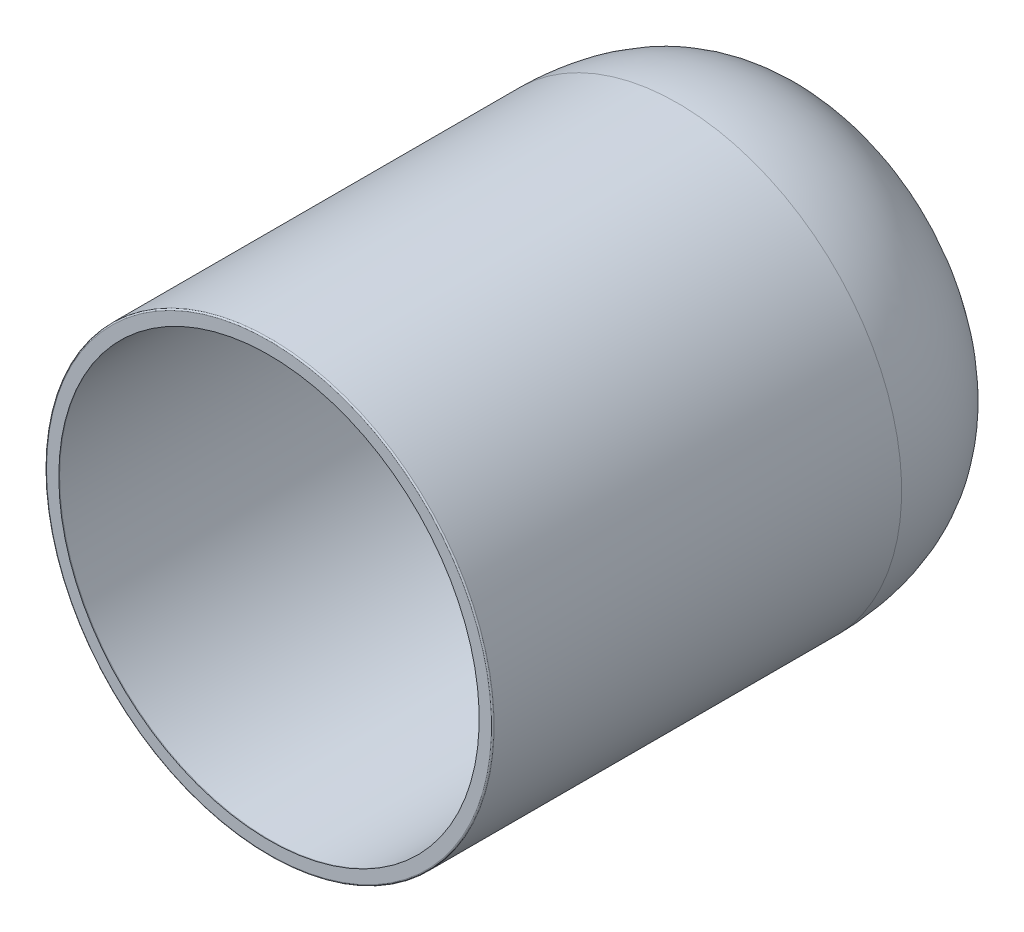
ISO-10303-21;
HEADER;
FILE_DESCRIPTION(('STEP AP214'),'2;1');
FILE_NAME('part.step','',(''),(''),'','','');
FILE_SCHEMA(('AUTOMOTIVE_DESIGN { 1 0 10303 214 1 1 1 1 }'));
ENDSEC;
DATA;
#1=APPLICATION_CONTEXT('core data for automotive mechanical design processes');
#2=APPLICATION_PROTOCOL_DEFINITION('international standard','automotive_design',2000,#1);
#3=PRODUCT_CONTEXT('',#1,'mechanical');
#4=PRODUCT('Part','Part','',(#3));
#5=PRODUCT_RELATED_PRODUCT_CATEGORY('part','',(#4));
#6=PRODUCT_DEFINITION_FORMATION('','',#4);
#7=PRODUCT_DEFINITION_CONTEXT('part definition',#1,'design');
#8=PRODUCT_DEFINITION('design','',#6,#7);
#9=PRODUCT_DEFINITION_SHAPE('','',#8);
#10=(LENGTH_UNIT() NAMED_UNIT(*) SI_UNIT(.MILLI.,.METRE.));
#11=(NAMED_UNIT(*) PLANE_ANGLE_UNIT() SI_UNIT($,.RADIAN.));
#12=(NAMED_UNIT(*) SI_UNIT($,.STERADIAN.) SOLID_ANGLE_UNIT());
#13=UNCERTAINTY_MEASURE_WITH_UNIT(LENGTH_MEASURE(1.E-05),#10,'distance_accuracy_value','');
#14=(GEOMETRIC_REPRESENTATION_CONTEXT(3) GLOBAL_UNCERTAINTY_ASSIGNED_CONTEXT((#13)) GLOBAL_UNIT_ASSIGNED_CONTEXT((#10,
#11,#12)) REPRESENTATION_CONTEXT('',''));
#15=CARTESIAN_POINT('',(0.,0.,0.));
#16=DIRECTION('',(0.,0.,1.));
#17=DIRECTION('',(1.,0.,0.));
#18=AXIS2_PLACEMENT_3D('',#15,#16,#17);
#19=CARTESIAN_POINT('',(0.,-38.3207921830978,53.6569293930287));
#20=CARTESIAN_POINT('',(0.,-38.0207091721635,55.6083247743343));
#21=CARTESIAN_POINT('',(0.,-38.0421077591396,57.5306118225564));
#22=CARTESIAN_POINT('',(0.,-38.5879224033195,61.1962030846169));
#23=CARTESIAN_POINT('',(0.,-39.1081277763689,62.9393403902587));
#24=CARTESIAN_POINT('',(0.,-40.4701360247986,66.2242620091485));
#25=CARTESIAN_POINT('',(0.,-41.3114963206142,67.7685425918928));
#26=CARTESIAN_POINT('',(0.,-42.7131570767652,69.9558804691951));
#27=CARTESIAN_POINT('',(0.,-43.2071362300748,70.6669740941805));
#28=CARTESIAN_POINT('',(0.,-44.2110882810383,72.0302657556224));
#29=CARTESIAN_POINT('',(0.,-44.7191183351667,72.6825121905557));
#30=CARTESIAN_POINT('',(0.,-46.2206986985432,74.5711343421093));
#31=CARTESIAN_POINT('',(0.,-47.1910359338219,75.7419604793616));
#32=CARTESIAN_POINT('',(0.,-48.8757665421096,77.9585799834199));
#33=CARTESIAN_POINT('',(0.,-49.5866998130821,79.0027369681696));
#34=CARTESIAN_POINT('',(0.,-50.3616080331738,80.4619140374314));
#35=CARTESIAN_POINT('',(0.,-50.5723566403992,80.9298370927059));
#36=CARTESIAN_POINT('',(0.,-50.8996411865929,81.8346324300413));
#37=CARTESIAN_POINT('',(0.,-51.0167021411255,82.2710431823319));
#38=CARTESIAN_POINT('',(0.,-51.1643571129199,83.1414180050003));
#39=CARTESIAN_POINT('',(0.,-51.1958068018795,83.575891269147));
#40=CARTESIAN_POINT('',(0.,-51.1637261420258,84.4975393806185));
#41=CARTESIAN_POINT('',(0.,-51.1000606260458,84.9858975483153));
#42=CARTESIAN_POINT('',(0.,-50.9687736623648,85.5269446026038));
#43=B_SPLINE_CURVE_WITH_KNOTS('',3,(#19,#20,#21,#22,#23,#24,#25,#26,#27,#28,#29,#30,#31,#32,#33,
#34,#35,#36,#37,#38,#39,#40,#41,#42),.UNSPECIFIED.,.F.,.F.,(4,2,2,2,2,2,2,2,2,2,2,4),(0.,0.125,
0.249999999999999,0.374999999999999,0.437499999999999,0.499999999999999,0.624999999999999,
0.749999999999999,0.8125,0.875,0.9375,1.),.UNSPECIFIED.);
#44=CARTESIAN_POINT('',(0.,27.1814269774537,-103.006751271339));
#45=DIRECTION('',(0.,0.,-1.));
#46=AXIS1_PLACEMENT('',#44,#45);
#47=SURFACE_OF_REVOLUTION('',#43,#46);
#48=CARTESIAN_POINT('',(0.,27.1814269774537,53.9463844687138));
#49=DIRECTION('',(0.,0.,-1.));
#50=DIRECTION('',(-1.,0.,0.));
#51=AXIS2_PLACEMENT_3D('',#48,#49,#50);
#52=CIRCLE('',#51,65.460026060339);
#53=CARTESIAN_POINT('',(-65.460026060339,27.1814269774537,53.9463844687138));
#54=VERTEX_POINT('',#53);
#55=EDGE_CURVE('E52',#54,#54,#52,.F.);
#56=ORIENTED_EDGE('',*,*,#55,.T.);
#57=EDGE_LOOP('',(#56));
#58=FACE_BOUND('',#57,.T.);
#59=CARTESIAN_POINT('',(0.,27.1814269774537,53.6569293930287));
#60=DIRECTION('',(0.,0.,-1.));
#61=DIRECTION('',(-1.,0.,0.));
#62=AXIS2_PLACEMENT_3D('',#59,#60,#61);
#63=CIRCLE('',#62,65.5022191605515);
#64=CARTESIAN_POINT('',(-65.5022191605515,27.1814269774537,53.6569293930287));
#65=VERTEX_POINT('',#64);
#66=EDGE_CURVE('E98',#65,#65,#63,.T.);
#67=ORIENTED_EDGE('',*,*,#66,.T.);
#68=EDGE_LOOP('',(#67));
#69=FACE_BOUND('',#68,.T.);
#70=ADVANCED_FACE('F30',(#58,#69),#47,.T.);
#71=CARTESIAN_POINT('',(0.,27.1814269774537,-103.006751271339));
#72=DIRECTION('',(0.,0.,-1.));
#73=DIRECTION('',(-1.,0.,0.));
#74=AXIS2_PLACEMENT_3D('',#71,#72,#73);
#75=CYLINDRICAL_SURFACE('',#74,65.5022191605515);
#76=ORIENTED_EDGE('',*,*,#66,.F.);
#77=EDGE_LOOP('',(#76));
#78=FACE_BOUND('',#77,.T.);
#79=CARTESIAN_POINT('',(0.,27.1814269774537,-73.3542157652085));
#80=DIRECTION('',(0.,0.,-1.));
#81=DIRECTION('',(-1.,0.,0.));
#82=AXIS2_PLACEMENT_3D('',#79,#80,#81);
#83=CIRCLE('',#82,65.5022191605515);
#84=CARTESIAN_POINT('',(-65.5022191605515,27.1814269774537,-73.3542157652085));
#85=VERTEX_POINT('',#84);
#86=EDGE_CURVE('E101',#85,#85,#83,.T.);
#87=ORIENTED_EDGE('',*,*,#86,.T.);
#88=EDGE_LOOP('',(#87));
#89=FACE_BOUND('',#88,.T.);
#90=ADVANCED_FACE('F59',(#78,#89),#75,.F.);
#91=CARTESIAN_POINT('',(0.,-2.19516978113754,-116.645853154217));
#92=CARTESIAN_POINT('',(0.,-5.27054969344217,-116.395073621911));
#93=CARTESIAN_POINT('',(0.,-8.12430036390622,-115.945910078192));
#94=CARTESIAN_POINT('',(0.,-13.3932399754993,-114.671809423202));
#95=CARTESIAN_POINT('',(0.,-15.8081574937502,-113.847370368567));
#96=CARTESIAN_POINT('',(0.,-20.2230347210334,-111.842237742883));
#97=CARTESIAN_POINT('',(0.,-22.2234372540035,-110.662229543283));
#98=CARTESIAN_POINT('',(0.,-25.8525527385388,-107.944167024262));
#99=CARTESIAN_POINT('',(0.,-27.4823703929168,-106.40587964915));
#100=CARTESIAN_POINT('',(0.,-30.4079289425042,-102.937041264463));
#101=CARTESIAN_POINT('',(0.,-31.7039426143527,-101.005400496892));
#102=CARTESIAN_POINT('',(0.,-33.9675604502165,-96.7057415617165));
#103=CARTESIAN_POINT('',(0.,-34.9345007270559,-94.3372599367677));
#104=CARTESIAN_POINT('',(0.,-37.3148525820225,-86.5386911677093));
#105=CARTESIAN_POINT('',(0.,-38.2031259963746,-80.4112538422503));
#106=CARTESIAN_POINT('',(0.,-38.3207921830978,-73.3542157652085));
#107=B_SPLINE_CURVE_WITH_KNOTS('',3,(#91,#92,#93,#94,#95,#96,#97,#98,#99,#100,#101,#102,#103,
#104,#105,#106),.UNSPECIFIED.,.F.,.F.,(4,2,2,2,2,2,2,4),(0.,0.125,0.25,0.375,0.5,0.625,0.75,1.),.UNSPECIFIED.);
#108=CARTESIAN_POINT('',(0.,27.1814269774537,-103.006751271339));
#109=DIRECTION('',(0.,0.,-1.));
#110=AXIS1_PLACEMENT('',#108,#109);
#111=SURFACE_OF_REVOLUTION('',#107,#110);
#112=ORIENTED_EDGE('',*,*,#86,.F.);
#113=EDGE_LOOP('',(#112));
#114=FACE_BOUND('',#113,.T.);
#115=CARTESIAN_POINT('',(0.,27.1814269774537,-116.645853154217));
#116=DIRECTION('',(0.,0.,-1.));
#117=DIRECTION('',(-1.,0.,0.));
#118=AXIS2_PLACEMENT_3D('',#115,#116,#117);
#119=CIRCLE('',#118,29.3765967585913);
#120=CARTESIAN_POINT('',(-29.3765967585913,27.1814269774537,-116.645853154217));
#121=VERTEX_POINT('',#120);
#122=EDGE_CURVE('E102',#121,#121,#119,.T.);
#123=ORIENTED_EDGE('',*,*,#122,.T.);
#124=EDGE_LOOP('',(#123));
#125=FACE_BOUND('',#124,.T.);
#126=ADVANCED_FACE('F87',(#114,#125),#111,.T.);
#127=CARTESIAN_POINT('',(0.,27.1814269774537,-116.645853154217));
#128=DIRECTION('',(0.,0.,-1.));
#129=DIRECTION('',(-1.,0.,0.));
#130=AXIS2_PLACEMENT_3D('',#127,#128,#129);
#131=CONICAL_SURFACE('',#130,29.3765967585913,0.0813642206208159);
#132=CARTESIAN_POINT('',(0.,27.1814269774537,-120.822988309859));
#133=DIRECTION('',(0.,0.,-1.));
#134=DIRECTION('',(-1.,0.,0.));
#135=AXIS2_PLACEMENT_3D('',#132,#133,#134);
#136=CIRCLE('',#135,29.7172180901285);
#137=CARTESIAN_POINT('',(-29.7172180901285,27.1814269774537,-120.822988309859));
#138=VERTEX_POINT('',#137);
#139=EDGE_CURVE('E45',#138,#138,#136,.T.);
#140=ORIENTED_EDGE('',*,*,#139,.T.);
#141=EDGE_LOOP('',(#140));
#142=FACE_BOUND('',#141,.T.);
#143=ORIENTED_EDGE('',*,*,#122,.F.);
#144=EDGE_LOOP('',(#143));
#145=FACE_BOUND('',#144,.T.);
#146=ADVANCED_FACE('F70',(#142,#145),#131,.F.);
#147=CARTESIAN_POINT('',(0.,-2.53579111267479,-120.822988309859));
#148=CARTESIAN_POINT('',(0.,-41.7899189100395,-117.622040104817));
#149=CARTESIAN_POINT('',(0.,-42.5117921830978,-73.3887780845075));
#150=B_SPLINE_CURVE_WITH_KNOTS('',2,(#147,#148,#149),.UNSPECIFIED.,.F.,.F.,(3,3),(0.,1.),.UNSPECIFIED.);
#151=CARTESIAN_POINT('',(0.,27.1814269774537,-103.006751271339));
#152=DIRECTION('',(0.,0.,-1.));
#153=AXIS1_PLACEMENT('',#151,#152);
#154=SURFACE_OF_REVOLUTION('',#150,#153);
#155=CARTESIAN_POINT('',(0.,27.1814269774537,-73.3887780845075));
#156=DIRECTION('',(0.,0.,-1.));
#157=DIRECTION('',(-1.,0.,0.));
#158=AXIS2_PLACEMENT_3D('',#155,#156,#157);
#159=CIRCLE('',#158,69.6932191605515);
#160=CARTESIAN_POINT('',(-69.6932191605515,27.1814269774537,-73.3887780845075));
#161=VERTEX_POINT('',#160);
#162=EDGE_CURVE('E41',#161,#161,#159,.T.);
#163=ORIENTED_EDGE('',*,*,#162,.T.);
#164=EDGE_LOOP('',(#163));
#165=FACE_BOUND('',#164,.T.);
#166=ORIENTED_EDGE('',*,*,#139,.F.);
#167=EDGE_LOOP('',(#166));
#168=FACE_BOUND('',#167,.T.);
#169=ADVANCED_FACE('F67',(#165,#168),#154,.F.);
#170=CARTESIAN_POINT('',(0.,27.1814269774537,-103.006751271339));
#171=DIRECTION('',(0.,0.,-1.));
#172=DIRECTION('',(-1.,0.,0.));
#173=AXIS2_PLACEMENT_3D('',#170,#171,#172);
#174=CYLINDRICAL_SURFACE('',#173,69.6932191605515);
#175=CARTESIAN_POINT('',(0.,27.1814269774537,53.5272844687138));
#176=DIRECTION('',(0.,0.,-1.));
#177=DIRECTION('',(-1.,0.,0.));
#178=AXIS2_PLACEMENT_3D('',#175,#176,#177);
#179=CIRCLE('',#178,69.6932191605515);
#180=CARTESIAN_POINT('',(-69.6932191605515,27.1814269774537,53.5272844687138));
#181=VERTEX_POINT('',#180);
#182=EDGE_CURVE('E10',#181,#181,#179,.T.);
#183=ORIENTED_EDGE('',*,*,#182,.T.);
#184=EDGE_LOOP('',(#183));
#185=FACE_BOUND('',#184,.T.);
#186=ORIENTED_EDGE('',*,*,#162,.F.);
#187=EDGE_LOOP('',(#186));
#188=FACE_BOUND('',#187,.T.);
#189=ADVANCED_FACE('F64',(#185,#188),#174,.T.);
#190=CARTESIAN_POINT('',(70.1562907903959,-53.2257,53.9463844687138));
#191=DIRECTION('',(0.,0.,-1.));
#192=DIRECTION('',(-1.,0.,0.));
#193=AXIS2_PLACEMENT_3D('',#190,#191,#192);
#194=PLANE('',#193);
#195=CARTESIAN_POINT('',(0.,27.1814269774537,53.9463844687138));
#196=DIRECTION('',(0.,0.,-1.));
#197=DIRECTION('',(-1.,0.,0.));
#198=AXIS2_PLACEMENT_3D('',#195,#196,#197);
#199=CIRCLE('',#198,69.2741191605515);
#200=CARTESIAN_POINT('',(-69.2741191605515,27.1814269774537,53.9463844687138));
#201=VERTEX_POINT('',#200);
#202=EDGE_CURVE('E37',#201,#201,#199,.F.);
#203=ORIENTED_EDGE('',*,*,#202,.T.);
#204=EDGE_LOOP('',(#203));
#205=FACE_BOUND('',#204,.T.);
#206=ORIENTED_EDGE('',*,*,#55,.F.);
#207=EDGE_LOOP('',(#206));
#208=FACE_BOUND('',#207,.T.);
#209=ADVANCED_FACE('F61',(#205,#208),#194,.F.);
#210=CARTESIAN_POINT('',(0.,27.1814269774537,53.5272844687138));
#211=DIRECTION('',(0.,0.,-1.));
#212=DIRECTION('',(-1.,0.,0.));
#213=AXIS2_PLACEMENT_3D('',#210,#211,#212);
#214=TOROIDAL_SURFACE('',#213,69.2741191605515,0.4191);
#215=ORIENTED_EDGE('',*,*,#182,.F.);
#216=EDGE_LOOP('',(#215));
#217=FACE_BOUND('',#216,.T.);
#218=ORIENTED_EDGE('',*,*,#202,.F.);
#219=EDGE_LOOP('',(#218));
#220=FACE_BOUND('',#219,.T.);
#221=ADVANCED_FACE('F32',(#217,#220),#214,.T.);
#222=CLOSED_SHELL('',(#70,#90,#126,#146,#169,#189,#209,#221));
#223=MANIFOLD_SOLID_BREP('B2',#222);
#224=ADVANCED_BREP_SHAPE_REPRESENTATION('',(#18,#223),#14);
#225=SHAPE_DEFINITION_REPRESENTATION(#9,#224);
ENDSEC;
END-ISO-10303-21;
